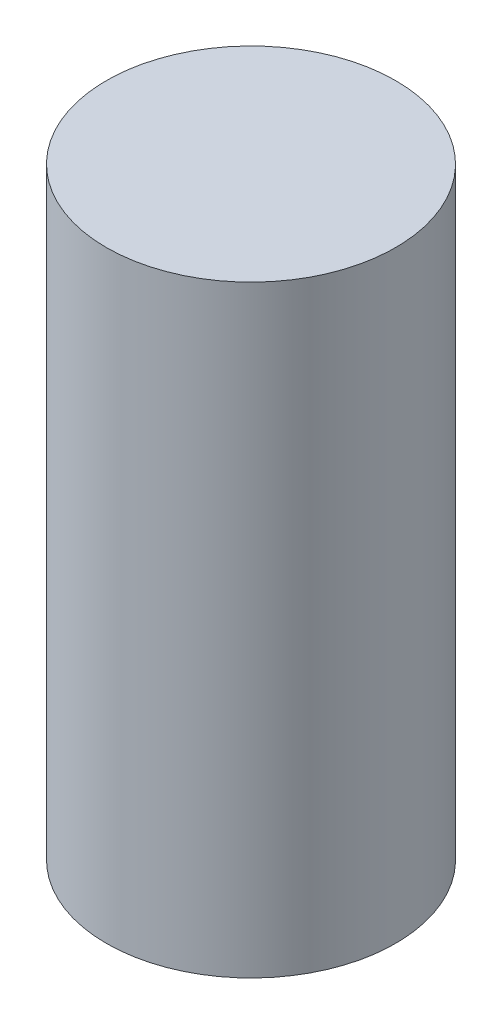
ISO-10303-21;
HEADER;
FILE_DESCRIPTION(('STEP AP214'),'2;1');
FILE_NAME('part.step','',(''),(''),'','','');
FILE_SCHEMA(('AUTOMOTIVE_DESIGN { 1 0 10303 214 1 1 1 1 }'));
ENDSEC;
DATA;
#1=APPLICATION_CONTEXT('core data for automotive mechanical design processes');
#2=APPLICATION_PROTOCOL_DEFINITION('international standard','automotive_design',2000,#1);
#3=PRODUCT_CONTEXT('',#1,'mechanical');
#4=PRODUCT('Part','Part','',(#3));
#5=PRODUCT_RELATED_PRODUCT_CATEGORY('part','',(#4));
#6=PRODUCT_DEFINITION_FORMATION('','',#4);
#7=PRODUCT_DEFINITION_CONTEXT('part definition',#1,'design');
#8=PRODUCT_DEFINITION('design','',#6,#7);
#9=PRODUCT_DEFINITION_SHAPE('','',#8);
#10=(LENGTH_UNIT() NAMED_UNIT(*) SI_UNIT(.MILLI.,.METRE.));
#11=(NAMED_UNIT(*) PLANE_ANGLE_UNIT() SI_UNIT($,.RADIAN.));
#12=(NAMED_UNIT(*) SI_UNIT($,.STERADIAN.) SOLID_ANGLE_UNIT());
#13=UNCERTAINTY_MEASURE_WITH_UNIT(LENGTH_MEASURE(1.E-05),#10,'distance_accuracy_value','');
#14=(GEOMETRIC_REPRESENTATION_CONTEXT(3) GLOBAL_UNCERTAINTY_ASSIGNED_CONTEXT((#13)) GLOBAL_UNIT_ASSIGNED_CONTEXT((#10,
#11,#12)) REPRESENTATION_CONTEXT('',''));
#15=CARTESIAN_POINT('',(0.,0.,0.));
#16=DIRECTION('',(0.,0.,1.));
#17=DIRECTION('',(1.,0.,0.));
#18=AXIS2_PLACEMENT_3D('',#15,#16,#17);
#19=CARTESIAN_POINT('',(0.,6.35,0.));
#20=DIRECTION('',(0.,-1.,0.));
#21=DIRECTION('',(0.,0.,-1.));
#22=AXIS2_PLACEMENT_3D('',#19,#20,#21);
#23=CYLINDRICAL_SURFACE('',#22,3.048);
#24=CARTESIAN_POINT('',(0.,6.35,0.));
#25=DIRECTION('',(0.,1.,0.));
#26=DIRECTION('',(0.,0.,1.));
#27=AXIS2_PLACEMENT_3D('',#24,#25,#26);
#28=CIRCLE('',#27,3.048);
#29=CARTESIAN_POINT('',(0.,6.35,3.048));
#30=VERTEX_POINT('',#29);
#31=EDGE_CURVE('E10',#30,#30,#28,.T.);
#32=ORIENTED_EDGE('',*,*,#31,.F.);
#33=EDGE_LOOP('',(#32));
#34=FACE_BOUND('',#33,.T.);
#35=CARTESIAN_POINT('',(0.,-6.35,0.));
#36=DIRECTION('',(0.,1.,0.));
#37=DIRECTION('',(0.,0.,1.));
#38=AXIS2_PLACEMENT_3D('',#35,#36,#37);
#39=CIRCLE('',#38,3.048);
#40=CARTESIAN_POINT('',(0.,-6.35,3.048));
#41=VERTEX_POINT('',#40);
#42=EDGE_CURVE('E36',#41,#41,#39,.T.);
#43=ORIENTED_EDGE('',*,*,#42,.T.);
#44=EDGE_LOOP('',(#43));
#45=FACE_BOUND('',#44,.T.);
#46=ADVANCED_FACE('F33',(#34,#45),#23,.T.);
#47=CARTESIAN_POINT('',(0.,6.35,0.));
#48=DIRECTION('',(0.,1.,0.));
#49=DIRECTION('',(0.,0.,1.));
#50=AXIS2_PLACEMENT_3D('',#47,#48,#49);
#51=PLANE('',#50);
#52=ORIENTED_EDGE('',*,*,#31,.T.);
#53=EDGE_LOOP('',(#52));
#54=FACE_BOUND('',#53,.T.);
#55=ADVANCED_FACE('F48',(#54),#51,.T.);
#56=CARTESIAN_POINT('',(0.,-6.35,0.));
#57=DIRECTION('',(0.,1.,0.));
#58=DIRECTION('',(0.,0.,1.));
#59=AXIS2_PLACEMENT_3D('',#56,#57,#58);
#60=PLANE('',#59);
#61=ORIENTED_EDGE('',*,*,#42,.F.);
#62=EDGE_LOOP('',(#61));
#63=FACE_BOUND('',#62,.T.);
#64=ADVANCED_FACE('F46',(#63),#60,.F.);
#65=CLOSED_SHELL('',(#46,#55,#64));
#66=MANIFOLD_SOLID_BREP('B2',#65);
#67=ADVANCED_BREP_SHAPE_REPRESENTATION('',(#18,#66),#14);
#68=SHAPE_DEFINITION_REPRESENTATION(#9,#67);
ENDSEC;
END-ISO-10303-21;
